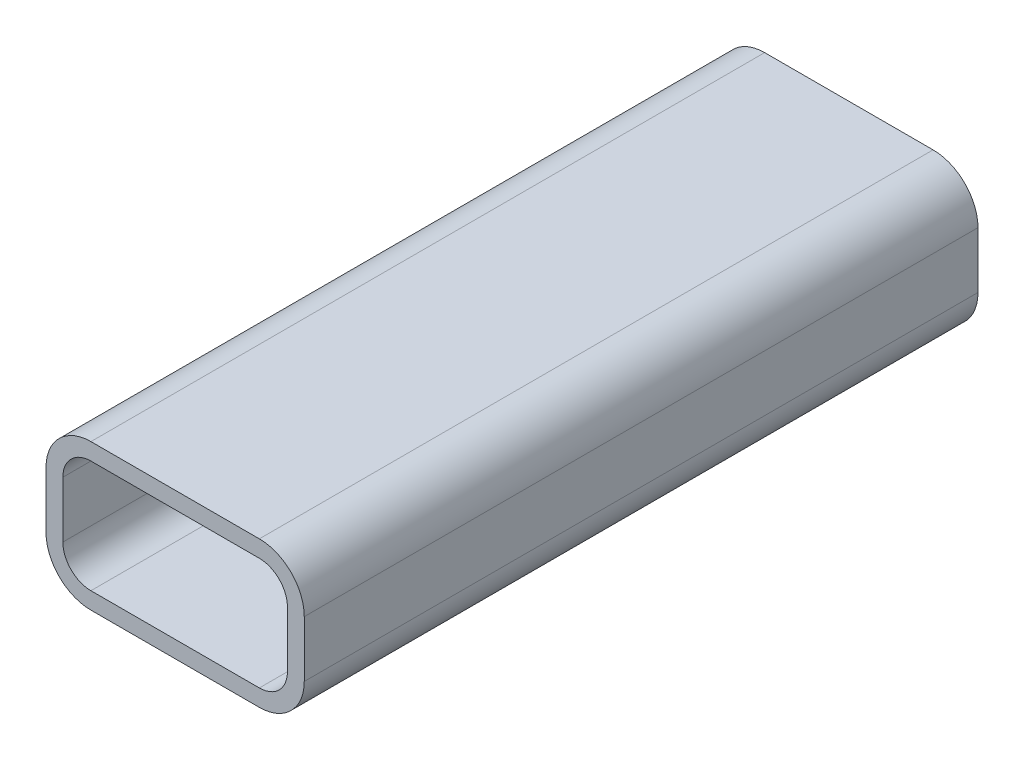
ISO-10303-21;
HEADER;
FILE_DESCRIPTION(('STEP AP214'),'2;1');
FILE_NAME('part.step','',(''),(''),'','','');
FILE_SCHEMA(('AUTOMOTIVE_DESIGN { 1 0 10303 214 1 1 1 1 }'));
ENDSEC;
DATA;
#1=APPLICATION_CONTEXT('core data for automotive mechanical design processes');
#2=APPLICATION_PROTOCOL_DEFINITION('international standard','automotive_design',2000,#1);
#3=PRODUCT_CONTEXT('',#1,'mechanical');
#4=PRODUCT('Part','Part','',(#3));
#5=PRODUCT_RELATED_PRODUCT_CATEGORY('part','',(#4));
#6=PRODUCT_DEFINITION_FORMATION('','',#4);
#7=PRODUCT_DEFINITION_CONTEXT('part definition',#1,'design');
#8=PRODUCT_DEFINITION('design','',#6,#7);
#9=PRODUCT_DEFINITION_SHAPE('','',#8);
#10=(LENGTH_UNIT() NAMED_UNIT(*) SI_UNIT(.MILLI.,.METRE.));
#11=(NAMED_UNIT(*) PLANE_ANGLE_UNIT() SI_UNIT($,.RADIAN.));
#12=(NAMED_UNIT(*) SI_UNIT($,.STERADIAN.) SOLID_ANGLE_UNIT());
#13=UNCERTAINTY_MEASURE_WITH_UNIT(LENGTH_MEASURE(1.E-05),#10,'distance_accuracy_value','');
#14=(GEOMETRIC_REPRESENTATION_CONTEXT(3) GLOBAL_UNCERTAINTY_ASSIGNED_CONTEXT((#13)) GLOBAL_UNIT_ASSIGNED_CONTEXT((#10,
#11,#12)) REPRESENTATION_CONTEXT('',''));
#15=CARTESIAN_POINT('',(0.,0.,0.));
#16=DIRECTION('',(0.,0.,1.));
#17=DIRECTION('',(1.,0.,0.));
#18=AXIS2_PLACEMENT_3D('',#15,#16,#17);
#19=CARTESIAN_POINT('',(15.,-5.,60.));
#20=DIRECTION('',(0.,0.,1.));
#21=DIRECTION('',(1.,0.,0.));
#22=AXIS2_PLACEMENT_3D('',#19,#20,#21);
#23=PLANE('',#22);
#24=CARTESIAN_POINT('',(15.,-5.,60.));
#25=DIRECTION('',(0.,0.,1.));
#26=DIRECTION('',(1.,0.,0.));
#27=AXIS2_PLACEMENT_3D('',#24,#25,#26);
#28=CIRCLE('',#27,8.);
#29=CARTESIAN_POINT('',(15.,-13.,60.));
#30=VERTEX_POINT('',#29);
#31=CARTESIAN_POINT('',(23.,-5.,60.));
#32=VERTEX_POINT('',#31);
#33=EDGE_CURVE('E289',#30,#32,#28,.T.);
#34=ORIENTED_EDGE('',*,*,#33,.T.);
#35=DIRECTION('',(0.,1.,0.));
#36=VECTOR('',#35,1.);
#37=CARTESIAN_POINT('',(23.,5.,60.));
#38=LINE('',#37,#36);
#39=CARTESIAN_POINT('',(23.,5.,60.));
#40=VERTEX_POINT('',#39);
#41=EDGE_CURVE('E293',#32,#40,#38,.T.);
#42=ORIENTED_EDGE('',*,*,#41,.T.);
#43=CARTESIAN_POINT('',(15.,5.,60.));
#44=DIRECTION('',(0.,0.,1.));
#45=DIRECTION('',(1.,0.,0.));
#46=AXIS2_PLACEMENT_3D('',#43,#44,#45);
#47=CIRCLE('',#46,8.);
#48=CARTESIAN_POINT('',(15.,13.,60.));
#49=VERTEX_POINT('',#48);
#50=EDGE_CURVE('E297',#40,#49,#47,.T.);
#51=ORIENTED_EDGE('',*,*,#50,.T.);
#52=DIRECTION('',(-1.,0.,0.));
#53=VECTOR('',#52,1.);
#54=CARTESIAN_POINT('',(15.,13.,60.));
#55=LINE('',#54,#53);
#56=CARTESIAN_POINT('',(-15.,13.,60.));
#57=VERTEX_POINT('',#56);
#58=EDGE_CURVE('E300',#49,#57,#55,.T.);
#59=ORIENTED_EDGE('',*,*,#58,.T.);
#60=CARTESIAN_POINT('',(-15.,5.,60.));
#61=DIRECTION('',(0.,0.,1.));
#62=DIRECTION('',(1.,0.,0.));
#63=AXIS2_PLACEMENT_3D('',#60,#61,#62);
#64=CIRCLE('',#63,8.);
#65=CARTESIAN_POINT('',(-23.,5.,60.));
#66=VERTEX_POINT('',#65);
#67=EDGE_CURVE('E303',#57,#66,#64,.T.);
#68=ORIENTED_EDGE('',*,*,#67,.T.);
#69=DIRECTION('',(0.,-1.,0.));
#70=VECTOR('',#69,1.);
#71=CARTESIAN_POINT('',(-23.,5.,60.));
#72=LINE('',#71,#70);
#73=CARTESIAN_POINT('',(-23.,-5.,60.));
#74=VERTEX_POINT('',#73);
#75=EDGE_CURVE('E306',#66,#74,#72,.T.);
#76=ORIENTED_EDGE('',*,*,#75,.T.);
#77=CARTESIAN_POINT('',(-15.,-5.,60.));
#78=DIRECTION('',(0.,0.,1.));
#79=DIRECTION('',(1.,0.,0.));
#80=AXIS2_PLACEMENT_3D('',#77,#78,#79);
#81=CIRCLE('',#80,8.);
#82=CARTESIAN_POINT('',(-15.,-13.,60.));
#83=VERTEX_POINT('',#82);
#84=EDGE_CURVE('E309',#74,#83,#81,.T.);
#85=ORIENTED_EDGE('',*,*,#84,.T.);
#86=DIRECTION('',(1.,0.,0.));
#87=VECTOR('',#86,1.);
#88=CARTESIAN_POINT('',(15.,-13.,60.));
#89=LINE('',#88,#87);
#90=EDGE_CURVE('E312',#83,#30,#89,.T.);
#91=ORIENTED_EDGE('',*,*,#90,.T.);
#92=EDGE_LOOP('',(#34,#42,#51,#59,#68,#76,#85,#91));
#93=FACE_BOUND('',#92,.T.);
#94=DIRECTION('',(0.,1.,0.));
#95=VECTOR('',#94,1.);
#96=CARTESIAN_POINT('',(20.,5.,60.));
#97=LINE('',#96,#95);
#98=CARTESIAN_POINT('',(20.,-5.,60.));
#99=VERTEX_POINT('',#98);
#100=CARTESIAN_POINT('',(20.,5.,60.));
#101=VERTEX_POINT('',#100);
#102=EDGE_CURVE('E209',#99,#101,#97,.T.);
#103=ORIENTED_EDGE('',*,*,#102,.F.);
#104=CARTESIAN_POINT('',(15.,-5.,60.));
#105=DIRECTION('',(0.,0.,1.));
#106=DIRECTION('',(1.,0.,0.));
#107=AXIS2_PLACEMENT_3D('',#104,#105,#106);
#108=CIRCLE('',#107,5.);
#109=CARTESIAN_POINT('',(15.,-10.,60.));
#110=VERTEX_POINT('',#109);
#111=EDGE_CURVE('E200',#110,#99,#108,.T.);
#112=ORIENTED_EDGE('',*,*,#111,.F.);
#113=DIRECTION('',(1.,0.,0.));
#114=VECTOR('',#113,1.);
#115=CARTESIAN_POINT('',(15.,-10.,60.));
#116=LINE('',#115,#114);
#117=CARTESIAN_POINT('',(-15.,-10.,60.));
#118=VERTEX_POINT('',#117);
#119=EDGE_CURVE('E241',#118,#110,#116,.T.);
#120=ORIENTED_EDGE('',*,*,#119,.F.);
#121=CARTESIAN_POINT('',(-15.,-5.,60.));
#122=DIRECTION('',(0.,0.,1.));
#123=DIRECTION('',(1.,0.,0.));
#124=AXIS2_PLACEMENT_3D('',#121,#122,#123);
#125=CIRCLE('',#124,5.);
#126=CARTESIAN_POINT('',(-20.,-5.,60.));
#127=VERTEX_POINT('',#126);
#128=EDGE_CURVE('E238',#127,#118,#125,.T.);
#129=ORIENTED_EDGE('',*,*,#128,.F.);
#130=DIRECTION('',(0.,-1.,0.));
#131=VECTOR('',#130,1.);
#132=CARTESIAN_POINT('',(-20.,5.,60.));
#133=LINE('',#132,#131);
#134=CARTESIAN_POINT('',(-20.,5.,60.));
#135=VERTEX_POINT('',#134);
#136=EDGE_CURVE('E235',#135,#127,#133,.T.);
#137=ORIENTED_EDGE('',*,*,#136,.F.);
#138=CARTESIAN_POINT('',(-15.,5.,60.));
#139=DIRECTION('',(0.,0.,1.));
#140=DIRECTION('',(-1.,0.,0.));
#141=AXIS2_PLACEMENT_3D('',#138,#139,#140);
#142=CIRCLE('',#141,5.);
#143=CARTESIAN_POINT('',(-15.,9.99999999999999,60.));
#144=VERTEX_POINT('',#143);
#145=EDGE_CURVE('E232',#144,#135,#142,.T.);
#146=ORIENTED_EDGE('',*,*,#145,.F.);
#147=DIRECTION('',(-1.,0.,0.));
#148=VECTOR('',#147,1.);
#149=CARTESIAN_POINT('',(15.,10.,60.));
#150=LINE('',#149,#148);
#151=CARTESIAN_POINT('',(15.,10.,60.));
#152=VERTEX_POINT('',#151);
#153=EDGE_CURVE('E227',#152,#144,#150,.T.);
#154=ORIENTED_EDGE('',*,*,#153,.F.);
#155=CARTESIAN_POINT('',(15.,5.,60.));
#156=DIRECTION('',(0.,0.,1.));
#157=DIRECTION('',(1.,0.,0.));
#158=AXIS2_PLACEMENT_3D('',#155,#156,#157);
#159=CIRCLE('',#158,5.);
#160=EDGE_CURVE('E223',#101,#152,#159,.T.);
#161=ORIENTED_EDGE('',*,*,#160,.F.);
#162=EDGE_LOOP('',(#103,#112,#120,#129,#137,#146,#154,#161));
#163=FACE_BOUND('',#162,.T.);
#164=ADVANCED_FACE('F86',(#93,#163),#23,.T.);
#165=CARTESIAN_POINT('',(15.,-5.,-60.));
#166=DIRECTION('',(0.,0.,1.));
#167=DIRECTION('',(1.,0.,0.));
#168=AXIS2_PLACEMENT_3D('',#165,#166,#167);
#169=PLANE('',#168);
#170=CARTESIAN_POINT('',(15.,-5.,-60.));
#171=DIRECTION('',(0.,0.,1.));
#172=DIRECTION('',(1.,0.,0.));
#173=AXIS2_PLACEMENT_3D('',#170,#171,#172);
#174=CIRCLE('',#173,8.);
#175=CARTESIAN_POINT('',(15.,-13.,-60.));
#176=VERTEX_POINT('',#175);
#177=CARTESIAN_POINT('',(23.,-5.,-60.));
#178=VERTEX_POINT('',#177);
#179=EDGE_CURVE('E218',#176,#178,#174,.T.);
#180=ORIENTED_EDGE('',*,*,#179,.F.);
#181=DIRECTION('',(1.,0.,0.));
#182=VECTOR('',#181,1.);
#183=CARTESIAN_POINT('',(15.,-13.,-60.));
#184=LINE('',#183,#182);
#185=CARTESIAN_POINT('',(-15.,-13.,-60.));
#186=VERTEX_POINT('',#185);
#187=EDGE_CURVE('E294',#186,#176,#184,.T.);
#188=ORIENTED_EDGE('',*,*,#187,.F.);
#189=CARTESIAN_POINT('',(-15.,-5.,-60.));
#190=DIRECTION('',(0.,0.,1.));
#191=DIRECTION('',(1.,0.,0.));
#192=AXIS2_PLACEMENT_3D('',#189,#190,#191);
#193=CIRCLE('',#192,8.);
#194=CARTESIAN_POINT('',(-23.,-5.,-60.));
#195=VERTEX_POINT('',#194);
#196=EDGE_CURVE('E334',#195,#186,#193,.T.);
#197=ORIENTED_EDGE('',*,*,#196,.F.);
#198=DIRECTION('',(0.,-1.,0.));
#199=VECTOR('',#198,1.);
#200=CARTESIAN_POINT('',(-23.,5.,-60.));
#201=LINE('',#200,#199);
#202=CARTESIAN_POINT('',(-23.,5.,-60.));
#203=VERTEX_POINT('',#202);
#204=EDGE_CURVE('E331',#203,#195,#201,.T.);
#205=ORIENTED_EDGE('',*,*,#204,.F.);
#206=CARTESIAN_POINT('',(-15.,5.,-60.));
#207=DIRECTION('',(0.,0.,1.));
#208=DIRECTION('',(1.,0.,0.));
#209=AXIS2_PLACEMENT_3D('',#206,#207,#208);
#210=CIRCLE('',#209,8.);
#211=CARTESIAN_POINT('',(-15.,13.,-60.));
#212=VERTEX_POINT('',#211);
#213=EDGE_CURVE('E328',#212,#203,#210,.T.);
#214=ORIENTED_EDGE('',*,*,#213,.F.);
#215=DIRECTION('',(-1.,0.,0.));
#216=VECTOR('',#215,1.);
#217=CARTESIAN_POINT('',(15.,13.,-60.));
#218=LINE('',#217,#216);
#219=CARTESIAN_POINT('',(15.,13.,-60.));
#220=VERTEX_POINT('',#219);
#221=EDGE_CURVE('E325',#220,#212,#218,.T.);
#222=ORIENTED_EDGE('',*,*,#221,.F.);
#223=CARTESIAN_POINT('',(15.,5.,-60.));
#224=DIRECTION('',(0.,0.,1.));
#225=DIRECTION('',(1.,0.,0.));
#226=AXIS2_PLACEMENT_3D('',#223,#224,#225);
#227=CIRCLE('',#226,8.);
#228=CARTESIAN_POINT('',(23.,5.,-60.));
#229=VERTEX_POINT('',#228);
#230=EDGE_CURVE('E322',#229,#220,#227,.T.);
#231=ORIENTED_EDGE('',*,*,#230,.F.);
#232=DIRECTION('',(0.,1.,0.));
#233=VECTOR('',#232,1.);
#234=CARTESIAN_POINT('',(23.,5.,-60.));
#235=LINE('',#234,#233);
#236=EDGE_CURVE('E319',#178,#229,#235,.T.);
#237=ORIENTED_EDGE('',*,*,#236,.F.);
#238=EDGE_LOOP('',(#180,#188,#197,#205,#214,#222,#231,#237));
#239=FACE_BOUND('',#238,.T.);
#240=CARTESIAN_POINT('',(15.,-5.,-60.));
#241=DIRECTION('',(0.,0.,1.));
#242=DIRECTION('',(1.,0.,0.));
#243=AXIS2_PLACEMENT_3D('',#240,#241,#242);
#244=CIRCLE('',#243,5.);
#245=CARTESIAN_POINT('',(15.,-10.,-60.));
#246=VERTEX_POINT('',#245);
#247=CARTESIAN_POINT('',(20.,-5.,-60.));
#248=VERTEX_POINT('',#247);
#249=EDGE_CURVE('E110',#246,#248,#244,.T.);
#250=ORIENTED_EDGE('',*,*,#249,.T.);
#251=DIRECTION('',(0.,1.,0.));
#252=VECTOR('',#251,1.);
#253=CARTESIAN_POINT('',(20.,5.,-60.));
#254=LINE('',#253,#252);
#255=CARTESIAN_POINT('',(20.,5.,-60.));
#256=VERTEX_POINT('',#255);
#257=EDGE_CURVE('E216',#248,#256,#254,.T.);
#258=ORIENTED_EDGE('',*,*,#257,.T.);
#259=CARTESIAN_POINT('',(15.,5.,-60.));
#260=DIRECTION('',(0.,0.,1.));
#261=DIRECTION('',(1.,0.,0.));
#262=AXIS2_PLACEMENT_3D('',#259,#260,#261);
#263=CIRCLE('',#262,5.);
#264=CARTESIAN_POINT('',(15.,10.,-60.));
#265=VERTEX_POINT('',#264);
#266=EDGE_CURVE('E248',#256,#265,#263,.T.);
#267=ORIENTED_EDGE('',*,*,#266,.T.);
#268=DIRECTION('',(-1.,0.,0.));
#269=VECTOR('',#268,1.);
#270=CARTESIAN_POINT('',(15.,10.,-60.));
#271=LINE('',#270,#269);
#272=CARTESIAN_POINT('',(-15.,9.99999999999999,-60.));
#273=VERTEX_POINT('',#272);
#274=EDGE_CURVE('E252',#265,#273,#271,.T.);
#275=ORIENTED_EDGE('',*,*,#274,.T.);
#276=CARTESIAN_POINT('',(-15.,5.,-60.));
#277=DIRECTION('',(0.,0.,1.));
#278=DIRECTION('',(-1.,0.,0.));
#279=AXIS2_PLACEMENT_3D('',#276,#277,#278);
#280=CIRCLE('',#279,5.);
#281=CARTESIAN_POINT('',(-20.,5.,-60.));
#282=VERTEX_POINT('',#281);
#283=EDGE_CURVE('E256',#273,#282,#280,.T.);
#284=ORIENTED_EDGE('',*,*,#283,.T.);
#285=DIRECTION('',(0.,-1.,0.));
#286=VECTOR('',#285,1.);
#287=CARTESIAN_POINT('',(-20.,5.,-60.));
#288=LINE('',#287,#286);
#289=CARTESIAN_POINT('',(-20.,-5.,-60.));
#290=VERTEX_POINT('',#289);
#291=EDGE_CURVE('E260',#282,#290,#288,.T.);
#292=ORIENTED_EDGE('',*,*,#291,.T.);
#293=CARTESIAN_POINT('',(-15.,-5.,-60.));
#294=DIRECTION('',(0.,0.,1.));
#295=DIRECTION('',(1.,0.,0.));
#296=AXIS2_PLACEMENT_3D('',#293,#294,#295);
#297=CIRCLE('',#296,5.);
#298=CARTESIAN_POINT('',(-15.,-10.,-60.));
#299=VERTEX_POINT('',#298);
#300=EDGE_CURVE('E264',#290,#299,#297,.T.);
#301=ORIENTED_EDGE('',*,*,#300,.T.);
#302=DIRECTION('',(1.,0.,0.));
#303=VECTOR('',#302,1.);
#304=CARTESIAN_POINT('',(15.,-10.,-60.));
#305=LINE('',#304,#303);
#306=EDGE_CURVE('E210',#299,#246,#305,.T.);
#307=ORIENTED_EDGE('',*,*,#306,.T.);
#308=EDGE_LOOP('',(#250,#258,#267,#275,#284,#292,#301,#307));
#309=FACE_BOUND('',#308,.T.);
#310=ADVANCED_FACE('F373',(#239,#309),#169,.F.);
#311=CARTESIAN_POINT('',(15.,-5.,60.));
#312=DIRECTION('',(0.,0.,-1.));
#313=DIRECTION('',(-1.,0.,0.));
#314=AXIS2_PLACEMENT_3D('',#311,#312,#313);
#315=CYLINDRICAL_SURFACE('',#314,8.);
#316=ORIENTED_EDGE('',*,*,#179,.T.);
#317=DIRECTION('',(0.,0.,-1.));
#318=VECTOR('',#317,1.);
#319=CARTESIAN_POINT('',(23.,-5.,60.));
#320=LINE('',#319,#318);
#321=EDGE_CURVE('E12',#32,#178,#320,.T.);
#322=ORIENTED_EDGE('',*,*,#321,.F.);
#323=ORIENTED_EDGE('',*,*,#33,.F.);
#324=DIRECTION('',(0.,0.,-1.));
#325=VECTOR('',#324,1.);
#326=CARTESIAN_POINT('',(15.,-13.,60.));
#327=LINE('',#326,#325);
#328=EDGE_CURVE('E315',#30,#176,#327,.T.);
#329=ORIENTED_EDGE('',*,*,#328,.T.);
#330=EDGE_LOOP('',(#316,#322,#323,#329));
#331=FACE_BOUND('',#330,.T.);
#332=ADVANCED_FACE('F88',(#331),#315,.T.);
#333=CARTESIAN_POINT('',(23.,5.,60.));
#334=DIRECTION('',(-1.,0.,0.));
#335=DIRECTION('',(0.,-1.,0.));
#336=AXIS2_PLACEMENT_3D('',#333,#334,#335);
#337=PLANE('',#336);
#338=ORIENTED_EDGE('',*,*,#236,.T.);
#339=DIRECTION('',(0.,0.,-1.));
#340=VECTOR('',#339,1.);
#341=CARTESIAN_POINT('',(23.,5.,60.));
#342=LINE('',#341,#340);
#343=EDGE_CURVE('E95',#40,#229,#342,.T.);
#344=ORIENTED_EDGE('',*,*,#343,.F.);
#345=ORIENTED_EDGE('',*,*,#41,.F.);
#346=ORIENTED_EDGE('',*,*,#321,.T.);
#347=EDGE_LOOP('',(#338,#344,#345,#346));
#348=FACE_BOUND('',#347,.T.);
#349=ADVANCED_FACE('F390',(#348),#337,.F.);
#350=CARTESIAN_POINT('',(15.,5.,60.));
#351=DIRECTION('',(0.,0.,-1.));
#352=DIRECTION('',(-1.,0.,0.));
#353=AXIS2_PLACEMENT_3D('',#350,#351,#352);
#354=CYLINDRICAL_SURFACE('',#353,8.);
#355=ORIENTED_EDGE('',*,*,#230,.T.);
#356=DIRECTION('',(0.,0.,-1.));
#357=VECTOR('',#356,1.);
#358=CARTESIAN_POINT('',(15.,13.,60.));
#359=LINE('',#358,#357);
#360=EDGE_CURVE('E358',#49,#220,#359,.T.);
#361=ORIENTED_EDGE('',*,*,#360,.F.);
#362=ORIENTED_EDGE('',*,*,#50,.F.);
#363=ORIENTED_EDGE('',*,*,#343,.T.);
#364=EDGE_LOOP('',(#355,#361,#362,#363));
#365=FACE_BOUND('',#364,.T.);
#366=ADVANCED_FACE('F367',(#365),#354,.T.);
#367=CARTESIAN_POINT('',(15.,13.,60.));
#368=DIRECTION('',(0.,-1.,0.));
#369=DIRECTION('',(1.,0.,0.));
#370=AXIS2_PLACEMENT_3D('',#367,#368,#369);
#371=PLANE('',#370);
#372=ORIENTED_EDGE('',*,*,#221,.T.);
#373=DIRECTION('',(0.,0.,-1.));
#374=VECTOR('',#373,1.);
#375=CARTESIAN_POINT('',(-15.,13.,60.));
#376=LINE('',#375,#374);
#377=EDGE_CURVE('E354',#57,#212,#376,.T.);
#378=ORIENTED_EDGE('',*,*,#377,.F.);
#379=ORIENTED_EDGE('',*,*,#58,.F.);
#380=ORIENTED_EDGE('',*,*,#360,.T.);
#381=EDGE_LOOP('',(#372,#378,#379,#380));
#382=FACE_BOUND('',#381,.T.);
#383=ADVANCED_FACE('F379',(#382),#371,.F.);
#384=CARTESIAN_POINT('',(-15.,5.,60.));
#385=DIRECTION('',(0.,0.,-1.));
#386=DIRECTION('',(-1.,0.,0.));
#387=AXIS2_PLACEMENT_3D('',#384,#385,#386);
#388=CYLINDRICAL_SURFACE('',#387,8.);
#389=ORIENTED_EDGE('',*,*,#213,.T.);
#390=DIRECTION('',(0.,0.,-1.));
#391=VECTOR('',#390,1.);
#392=CARTESIAN_POINT('',(-23.,5.,60.));
#393=LINE('',#392,#391);
#394=EDGE_CURVE('E350',#66,#203,#393,.T.);
#395=ORIENTED_EDGE('',*,*,#394,.F.);
#396=ORIENTED_EDGE('',*,*,#67,.F.);
#397=ORIENTED_EDGE('',*,*,#377,.T.);
#398=EDGE_LOOP('',(#389,#395,#396,#397));
#399=FACE_BOUND('',#398,.T.);
#400=ADVANCED_FACE('F383',(#399),#388,.T.);
#401=CARTESIAN_POINT('',(-23.,5.,60.));
#402=DIRECTION('',(1.,0.,0.));
#403=DIRECTION('',(0.,0.,-1.));
#404=AXIS2_PLACEMENT_3D('',#401,#402,#403);
#405=PLANE('',#404);
#406=ORIENTED_EDGE('',*,*,#204,.T.);
#407=DIRECTION('',(0.,0.,-1.));
#408=VECTOR('',#407,1.);
#409=CARTESIAN_POINT('',(-23.,-5.,60.));
#410=LINE('',#409,#408);
#411=EDGE_CURVE('E346',#74,#195,#410,.T.);
#412=ORIENTED_EDGE('',*,*,#411,.F.);
#413=ORIENTED_EDGE('',*,*,#75,.F.);
#414=ORIENTED_EDGE('',*,*,#394,.T.);
#415=EDGE_LOOP('',(#406,#412,#413,#414));
#416=FACE_BOUND('',#415,.T.);
#417=ADVANCED_FACE('F403',(#416),#405,.F.);
#418=CARTESIAN_POINT('',(-15.,-5.,60.));
#419=DIRECTION('',(0.,0.,-1.));
#420=DIRECTION('',(-1.,0.,0.));
#421=AXIS2_PLACEMENT_3D('',#418,#419,#420);
#422=CYLINDRICAL_SURFACE('',#421,8.);
#423=ORIENTED_EDGE('',*,*,#196,.T.);
#424=DIRECTION('',(0.,0.,-1.));
#425=VECTOR('',#424,1.);
#426=CARTESIAN_POINT('',(-15.,-13.,60.));
#427=LINE('',#426,#425);
#428=EDGE_CURVE('E342',#83,#186,#427,.T.);
#429=ORIENTED_EDGE('',*,*,#428,.F.);
#430=ORIENTED_EDGE('',*,*,#84,.F.);
#431=ORIENTED_EDGE('',*,*,#411,.T.);
#432=EDGE_LOOP('',(#423,#429,#430,#431));
#433=FACE_BOUND('',#432,.T.);
#434=ADVANCED_FACE('F401',(#433),#422,.T.);
#435=CARTESIAN_POINT('',(15.,-13.,60.));
#436=DIRECTION('',(0.,1.,0.));
#437=DIRECTION('',(-1.,0.,0.));
#438=AXIS2_PLACEMENT_3D('',#435,#436,#437);
#439=PLANE('',#438);
#440=ORIENTED_EDGE('',*,*,#187,.T.);
#441=ORIENTED_EDGE('',*,*,#328,.F.);
#442=ORIENTED_EDGE('',*,*,#90,.F.);
#443=ORIENTED_EDGE('',*,*,#428,.T.);
#444=EDGE_LOOP('',(#440,#441,#442,#443));
#445=FACE_BOUND('',#444,.T.);
#446=ADVANCED_FACE('F396',(#445),#439,.F.);
#447=CARTESIAN_POINT('',(15.,-5.,60.));
#448=DIRECTION('',(0.,0.,-1.));
#449=DIRECTION('',(-1.,0.,0.));
#450=AXIS2_PLACEMENT_3D('',#447,#448,#449);
#451=CYLINDRICAL_SURFACE('',#450,5.);
#452=ORIENTED_EDGE('',*,*,#249,.F.);
#453=DIRECTION('',(0.,0.,-1.));
#454=VECTOR('',#453,1.);
#455=CARTESIAN_POINT('',(15.,-10.,60.));
#456=LINE('',#455,#454);
#457=EDGE_CURVE('E204',#110,#246,#456,.T.);
#458=ORIENTED_EDGE('',*,*,#457,.F.);
#459=ORIENTED_EDGE('',*,*,#111,.T.);
#460=DIRECTION('',(0.,0.,-1.));
#461=VECTOR('',#460,1.);
#462=CARTESIAN_POINT('',(20.,-5.,60.));
#463=LINE('',#462,#461);
#464=EDGE_CURVE('E203',#99,#248,#463,.T.);
#465=ORIENTED_EDGE('',*,*,#464,.T.);
#466=EDGE_LOOP('',(#452,#458,#459,#465));
#467=FACE_BOUND('',#466,.T.);
#468=ADVANCED_FACE('F202',(#467),#451,.F.);
#469=CARTESIAN_POINT('',(20.,5.,60.));
#470=DIRECTION('',(-1.,0.,0.));
#471=DIRECTION('',(0.,-1.,0.));
#472=AXIS2_PLACEMENT_3D('',#469,#470,#471);
#473=PLANE('',#472);
#474=ORIENTED_EDGE('',*,*,#257,.F.);
#475=ORIENTED_EDGE('',*,*,#464,.F.);
#476=ORIENTED_EDGE('',*,*,#102,.T.);
#477=DIRECTION('',(0.,0.,-1.));
#478=VECTOR('',#477,1.);
#479=CARTESIAN_POINT('',(20.,5.,60.));
#480=LINE('',#479,#478);
#481=EDGE_CURVE('E219',#101,#256,#480,.T.);
#482=ORIENTED_EDGE('',*,*,#481,.T.);
#483=EDGE_LOOP('',(#474,#475,#476,#482));
#484=FACE_BOUND('',#483,.T.);
#485=ADVANCED_FACE('F213',(#484),#473,.T.);
#486=CARTESIAN_POINT('',(15.,5.,60.));
#487=DIRECTION('',(0.,0.,-1.));
#488=DIRECTION('',(-1.,0.,0.));
#489=AXIS2_PLACEMENT_3D('',#486,#487,#488);
#490=CYLINDRICAL_SURFACE('',#489,5.);
#491=ORIENTED_EDGE('',*,*,#266,.F.);
#492=ORIENTED_EDGE('',*,*,#481,.F.);
#493=ORIENTED_EDGE('',*,*,#160,.T.);
#494=DIRECTION('',(0.,0.,-1.));
#495=VECTOR('',#494,1.);
#496=CARTESIAN_POINT('',(15.,10.,60.));
#497=LINE('',#496,#495);
#498=EDGE_CURVE('E284',#152,#265,#497,.T.);
#499=ORIENTED_EDGE('',*,*,#498,.T.);
#500=EDGE_LOOP('',(#491,#492,#493,#499));
#501=FACE_BOUND('',#500,.T.);
#502=ADVANCED_FACE('F428',(#501),#490,.F.);
#503=CARTESIAN_POINT('',(15.,10.,60.));
#504=DIRECTION('',(0.,-1.,0.));
#505=DIRECTION('',(1.,0.,0.));
#506=AXIS2_PLACEMENT_3D('',#503,#504,#505);
#507=PLANE('',#506);
#508=ORIENTED_EDGE('',*,*,#274,.F.);
#509=ORIENTED_EDGE('',*,*,#498,.F.);
#510=ORIENTED_EDGE('',*,*,#153,.T.);
#511=DIRECTION('',(0.,0.,-1.));
#512=VECTOR('',#511,1.);
#513=CARTESIAN_POINT('',(-15.,9.99999999999999,60.));
#514=LINE('',#513,#512);
#515=EDGE_CURVE('E281',#144,#273,#514,.T.);
#516=ORIENTED_EDGE('',*,*,#515,.T.);
#517=EDGE_LOOP('',(#508,#509,#510,#516));
#518=FACE_BOUND('',#517,.T.);
#519=ADVANCED_FACE('F432',(#518),#507,.T.);
#520=CARTESIAN_POINT('',(-15.,5.,60.));
#521=DIRECTION('',(0.,0.,-1.));
#522=DIRECTION('',(-1.,0.,0.));
#523=AXIS2_PLACEMENT_3D('',#520,#521,#522);
#524=CYLINDRICAL_SURFACE('',#523,5.);
#525=ORIENTED_EDGE('',*,*,#283,.F.);
#526=ORIENTED_EDGE('',*,*,#515,.F.);
#527=ORIENTED_EDGE('',*,*,#145,.T.);
#528=DIRECTION('',(0.,0.,-1.));
#529=VECTOR('',#528,1.);
#530=CARTESIAN_POINT('',(-20.,5.,60.));
#531=LINE('',#530,#529);
#532=EDGE_CURVE('E278',#135,#282,#531,.T.);
#533=ORIENTED_EDGE('',*,*,#532,.T.);
#534=EDGE_LOOP('',(#525,#526,#527,#533));
#535=FACE_BOUND('',#534,.T.);
#536=ADVANCED_FACE('F438',(#535),#524,.F.);
#537=CARTESIAN_POINT('',(-20.,5.,60.));
#538=DIRECTION('',(1.,0.,0.));
#539=DIRECTION('',(0.,0.,-1.));
#540=AXIS2_PLACEMENT_3D('',#537,#538,#539);
#541=PLANE('',#540);
#542=ORIENTED_EDGE('',*,*,#291,.F.);
#543=ORIENTED_EDGE('',*,*,#532,.F.);
#544=ORIENTED_EDGE('',*,*,#136,.T.);
#545=DIRECTION('',(0.,0.,-1.));
#546=VECTOR('',#545,1.);
#547=CARTESIAN_POINT('',(-20.,-5.,60.));
#548=LINE('',#547,#546);
#549=EDGE_CURVE('E275',#127,#290,#548,.T.);
#550=ORIENTED_EDGE('',*,*,#549,.T.);
#551=EDGE_LOOP('',(#542,#543,#544,#550));
#552=FACE_BOUND('',#551,.T.);
#553=ADVANCED_FACE('F442',(#552),#541,.T.);
#554=CARTESIAN_POINT('',(-15.,-5.,60.));
#555=DIRECTION('',(0.,0.,-1.));
#556=DIRECTION('',(-1.,0.,0.));
#557=AXIS2_PLACEMENT_3D('',#554,#555,#556);
#558=CYLINDRICAL_SURFACE('',#557,5.);
#559=ORIENTED_EDGE('',*,*,#300,.F.);
#560=ORIENTED_EDGE('',*,*,#549,.F.);
#561=ORIENTED_EDGE('',*,*,#128,.T.);
#562=DIRECTION('',(0.,0.,-1.));
#563=VECTOR('',#562,1.);
#564=CARTESIAN_POINT('',(-15.,-10.,60.));
#565=LINE('',#564,#563);
#566=EDGE_CURVE('E102',#118,#299,#565,.T.);
#567=ORIENTED_EDGE('',*,*,#566,.T.);
#568=EDGE_LOOP('',(#559,#560,#561,#567));
#569=FACE_BOUND('',#568,.T.);
#570=ADVANCED_FACE('F446',(#569),#558,.F.);
#571=CARTESIAN_POINT('',(15.,-10.,60.));
#572=DIRECTION('',(0.,1.,0.));
#573=DIRECTION('',(-1.,0.,0.));
#574=AXIS2_PLACEMENT_3D('',#571,#572,#573);
#575=PLANE('',#574);
#576=ORIENTED_EDGE('',*,*,#306,.F.);
#577=ORIENTED_EDGE('',*,*,#566,.F.);
#578=ORIENTED_EDGE('',*,*,#119,.T.);
#579=ORIENTED_EDGE('',*,*,#457,.T.);
#580=EDGE_LOOP('',(#576,#577,#578,#579));
#581=FACE_BOUND('',#580,.T.);
#582=ADVANCED_FACE('F450',(#581),#575,.T.);
#583=CLOSED_SHELL('',(#164,#310,#332,#349,#366,#383,#400,#417,#434,#446,#468,#485,#502,#519,
#536,#553,#570,#582));
#584=MANIFOLD_SOLID_BREP('B2',#583);
#585=ADVANCED_BREP_SHAPE_REPRESENTATION('',(#18,#584),#14);
#586=SHAPE_DEFINITION_REPRESENTATION(#9,#585);
ENDSEC;
END-ISO-10303-21;
